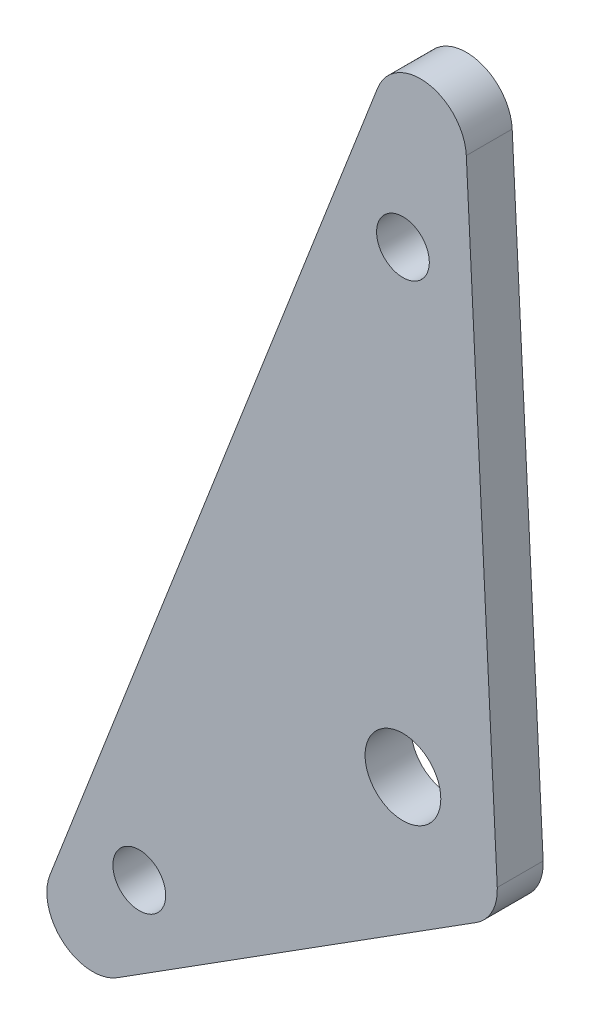
ISO-10303-21;
HEADER;
FILE_DESCRIPTION(('STEP AP214'),'2;1');
FILE_NAME('part.step','',(''),(''),'','','');
FILE_SCHEMA(('AUTOMOTIVE_DESIGN { 1 0 10303 214 1 1 1 1 }'));
ENDSEC;
DATA;
#1=APPLICATION_CONTEXT('core data for automotive mechanical design processes');
#2=APPLICATION_PROTOCOL_DEFINITION('international standard','automotive_design',2000,#1);
#3=PRODUCT_CONTEXT('',#1,'mechanical');
#4=PRODUCT('Part','Part','',(#3));
#5=PRODUCT_RELATED_PRODUCT_CATEGORY('part','',(#4));
#6=PRODUCT_DEFINITION_FORMATION('','',#4);
#7=PRODUCT_DEFINITION_CONTEXT('part definition',#1,'design');
#8=PRODUCT_DEFINITION('design','',#6,#7);
#9=PRODUCT_DEFINITION_SHAPE('','',#8);
#10=(LENGTH_UNIT() NAMED_UNIT(*) SI_UNIT(.MILLI.,.METRE.));
#11=(NAMED_UNIT(*) PLANE_ANGLE_UNIT() SI_UNIT($,.RADIAN.));
#12=(NAMED_UNIT(*) SI_UNIT($,.STERADIAN.) SOLID_ANGLE_UNIT());
#13=UNCERTAINTY_MEASURE_WITH_UNIT(LENGTH_MEASURE(1.E-05),#10,'distance_accuracy_value','');
#14=(GEOMETRIC_REPRESENTATION_CONTEXT(3) GLOBAL_UNCERTAINTY_ASSIGNED_CONTEXT((#13)) GLOBAL_UNIT_ASSIGNED_CONTEXT((#10,
#11,#12)) REPRESENTATION_CONTEXT('',''));
#15=CARTESIAN_POINT('',(0.,0.,0.));
#16=DIRECTION('',(0.,0.,1.));
#17=DIRECTION('',(1.,0.,0.));
#18=AXIS2_PLACEMENT_3D('',#15,#16,#17);
#19=CARTESIAN_POINT('',(0.764069965560594,24.737714391467,2.));
#20=DIRECTION('',(0.,0.,-1.));
#21=DIRECTION('',(-1.,0.,0.));
#22=AXIS2_PLACEMENT_3D('',#19,#20,#21);
#23=CYLINDRICAL_SURFACE('',#22,2.);
#24=CARTESIAN_POINT('',(0.764069965560594,24.737714391467,2.));
#25=DIRECTION('',(0.,0.,1.));
#26=DIRECTION('',(1.,0.,0.));
#27=AXIS2_PLACEMENT_3D('',#24,#25,#26);
#28=CIRCLE('',#27,2.);
#29=CARTESIAN_POINT('',(2.76156840110442,24.8377143914669,2.));
#30=VERTEX_POINT('',#29);
#31=CARTESIAN_POINT('',(-1.10071834008403,25.4606006723792,2.));
#32=VERTEX_POINT('',#31);
#33=EDGE_CURVE('E174',#30,#32,#28,.T.);
#34=ORIENTED_EDGE('',*,*,#33,.F.);
#35=DIRECTION('',(0.,0.,1.));
#36=VECTOR('',#35,1.);
#37=CARTESIAN_POINT('',(2.76156840110442,24.8377143914669,2.));
#38=LINE('',#37,#36);
#39=CARTESIAN_POINT('',(2.76156840110442,24.8377143914669,0.));
#40=VERTEX_POINT('',#39);
#41=EDGE_CURVE('E122',#40,#30,#38,.T.);
#42=ORIENTED_EDGE('',*,*,#41,.F.);
#43=CARTESIAN_POINT('',(0.764069965560594,24.737714391467,0.));
#44=DIRECTION('',(0.,0.,-1.));
#45=DIRECTION('',(1.,0.,0.));
#46=AXIS2_PLACEMENT_3D('',#43,#44,#45);
#47=CIRCLE('',#46,2.);
#48=CARTESIAN_POINT('',(-1.10071834008403,25.4606006723792,0.));
#49=VERTEX_POINT('',#48);
#50=EDGE_CURVE('E27',#49,#40,#47,.T.);
#51=ORIENTED_EDGE('',*,*,#50,.F.);
#52=DIRECTION('',(0.,0.,-1.));
#53=VECTOR('',#52,1.);
#54=CARTESIAN_POINT('',(-1.10071834008403,25.4606006723792,2.));
#55=LINE('',#54,#53);
#56=EDGE_CURVE('E140',#32,#49,#55,.T.);
#57=ORIENTED_EDGE('',*,*,#56,.F.);
#58=EDGE_LOOP('',(#34,#42,#51,#57));
#59=FACE_BOUND('',#58,.T.);
#60=ADVANCED_FACE('F17',(#59),#23,.T.);
#61=CARTESIAN_POINT('',(2.11328151066973,-2.21276511426466,2.));
#62=DIRECTION('',(0.,0.,-1.));
#63=DIRECTION('',(-1.,0.,0.));
#64=AXIS2_PLACEMENT_3D('',#61,#62,#63);
#65=CYLINDRICAL_SURFACE('',#64,2.);
#66=CARTESIAN_POINT('',(2.11328151066973,-2.21276511426466,2.));
#67=DIRECTION('',(0.,0.,1.));
#68=DIRECTION('',(1.,0.,0.));
#69=AXIS2_PLACEMENT_3D('',#66,#67,#68);
#70=CIRCLE('',#69,2.);
#71=CARTESIAN_POINT('',(3.18309963190795,-3.90258439083547,2.));
#72=VERTEX_POINT('',#71);
#73=CARTESIAN_POINT('',(4.11077994621355,-2.11276511426466,2.));
#74=VERTEX_POINT('',#73);
#75=EDGE_CURVE('E50',#72,#74,#70,.T.);
#76=ORIENTED_EDGE('',*,*,#75,.F.);
#77=DIRECTION('',(0.,0.,1.));
#78=VECTOR('',#77,1.);
#79=CARTESIAN_POINT('',(3.18309963190795,-3.90258439083547,2.));
#80=LINE('',#79,#78);
#81=CARTESIAN_POINT('',(3.18309963190795,-3.90258439083547,0.));
#82=VERTEX_POINT('',#81);
#83=EDGE_CURVE('E96',#82,#72,#80,.T.);
#84=ORIENTED_EDGE('',*,*,#83,.F.);
#85=CARTESIAN_POINT('',(2.11328151066973,-2.21276511426466,0.));
#86=DIRECTION('',(0.,0.,-1.));
#87=DIRECTION('',(1.,0.,0.));
#88=AXIS2_PLACEMENT_3D('',#85,#86,#87);
#89=CIRCLE('',#88,2.);
#90=CARTESIAN_POINT('',(4.11077994621355,-2.11276511426466,0.));
#91=VERTEX_POINT('',#90);
#92=EDGE_CURVE('E11',#91,#82,#89,.T.);
#93=ORIENTED_EDGE('',*,*,#92,.F.);
#94=DIRECTION('',(0.,0.,-1.));
#95=VECTOR('',#94,1.);
#96=CARTESIAN_POINT('',(4.11077994621355,-2.11276511426466,2.));
#97=LINE('',#96,#95);
#98=EDGE_CURVE('E154',#74,#91,#97,.T.);
#99=ORIENTED_EDGE('',*,*,#98,.F.);
#100=EDGE_LOOP('',(#76,#84,#93,#99));
#101=FACE_BOUND('',#100,.T.);
#102=ADVANCED_FACE('F19',(#101),#65,.T.);
#103=CARTESIAN_POINT('',(0.,0.,0.));
#104=DIRECTION('',(0.,0.,1.));
#105=DIRECTION('',(1.,0.,0.));
#106=AXIS2_PLACEMENT_3D('',#103,#104,#105);
#107=PLANE('',#106);
#108=CARTESIAN_POINT('',(-11.4906666467847,-9.64181414529806,0.));
#109=DIRECTION('',(0.,0.,1.));
#110=DIRECTION('',(1.,0.,0.));
#111=AXIS2_PLACEMENT_3D('',#108,#109,#110);
#112=CIRCLE('',#111,1.15);
#113=CARTESIAN_POINT('',(-10.3406666467847,-9.64181414529806,0.));
#114=VERTEX_POINT('',#113);
#115=EDGE_CURVE('E126',#114,#114,#112,.T.);
#116=ORIENTED_EDGE('',*,*,#115,.T.);
#117=EDGE_LOOP('',(#116));
#118=FACE_BOUND('',#117,.T.);
#119=CARTESIAN_POINT('',(0.,20.,0.));
#120=DIRECTION('',(0.,0.,1.));
#121=DIRECTION('',(1.,0.,0.));
#122=AXIS2_PLACEMENT_3D('',#119,#120,#121);
#123=CIRCLE('',#122,1.15);
#124=CARTESIAN_POINT('',(1.15,20.,0.));
#125=VERTEX_POINT('',#124);
#126=EDGE_CURVE('E142',#125,#125,#123,.T.);
#127=ORIENTED_EDGE('',*,*,#126,.T.);
#128=EDGE_LOOP('',(#127));
#129=FACE_BOUND('',#128,.T.);
#130=CARTESIAN_POINT('',(0.,0.,0.));
#131=DIRECTION('',(0.,0.,1.));
#132=DIRECTION('',(1.,0.,0.));
#133=AXIS2_PLACEMENT_3D('',#130,#131,#132);
#134=CIRCLE('',#133,1.65);
#135=CARTESIAN_POINT('',(1.65,0.,0.));
#136=VERTEX_POINT('',#135);
#137=EDGE_CURVE('E130',#136,#136,#134,.T.);
#138=ORIENTED_EDGE('',*,*,#137,.T.);
#139=EDGE_LOOP('',(#138));
#140=FACE_BOUND('',#139,.T.);
#141=DIRECTION('',(-0.844909638285409,-0.53490906061911,0.));
#142=VECTOR('',#141,1.);
#143=CARTESIAN_POINT('',(2.67454530309555,-4.22454819142705,0.));
#144=LINE('',#143,#142);
#145=CARTESIAN_POINT('',(-12.4502094461774,-13.799972578165,0.));
#146=VERTEX_POINT('',#145);
#147=EDGE_CURVE('E87',#82,#146,#144,.T.);
#148=ORIENTED_EDGE('',*,*,#147,.T.);
#149=CARTESIAN_POINT('',(-13.5200275674156,-12.1101533015942,0.));
#150=DIRECTION('',(0.,0.,-1.));
#151=DIRECTION('',(1.,0.,0.));
#152=AXIS2_PLACEMENT_3D('',#149,#150,#151);
#153=CIRCLE('',#152,2.);
#154=CARTESIAN_POINT('',(-15.3848158730602,-11.387267020682,0.));
#155=VERTEX_POINT('',#154);
#156=EDGE_CURVE('E95',#146,#155,#153,.T.);
#157=ORIENTED_EDGE('',*,*,#156,.T.);
#158=DIRECTION('',(0.361443140456094,0.932394152822312,0.));
#159=VECTOR('',#158,1.);
#160=CARTESIAN_POINT('',(-9.53733187324684,3.69715229702356,0.));
#161=LINE('',#160,#159);
#162=EDGE_CURVE('E163',#155,#49,#161,.T.);
#163=ORIENTED_EDGE('',*,*,#162,.T.);
#164=ORIENTED_EDGE('',*,*,#50,.T.);
#165=DIRECTION('',(0.05,-0.998749217771909,0.));
#166=VECTOR('',#165,1.);
#167=CARTESIAN_POINT('',(3.99499687108763,0.2,0.));
#168=LINE('',#167,#166);
#169=EDGE_CURVE('E157',#40,#91,#168,.T.);
#170=ORIENTED_EDGE('',*,*,#169,.T.);
#171=ORIENTED_EDGE('',*,*,#92,.T.);
#172=EDGE_LOOP('',(#148,#157,#163,#164,#170,#171));
#173=FACE_BOUND('',#172,.T.);
#174=ADVANCED_FACE('F90',(#118,#129,#140,#173),#107,.F.);
#175=CARTESIAN_POINT('',(0.,0.,2.));
#176=DIRECTION('',(0.,0.,1.));
#177=DIRECTION('',(1.,0.,0.));
#178=AXIS2_PLACEMENT_3D('',#175,#176,#177);
#179=PLANE('',#178);
#180=CARTESIAN_POINT('',(-11.4906666467847,-9.64181414529806,2.));
#181=DIRECTION('',(0.,0.,1.));
#182=DIRECTION('',(1.,0.,0.));
#183=AXIS2_PLACEMENT_3D('',#180,#181,#182);
#184=CIRCLE('',#183,1.15);
#185=CARTESIAN_POINT('',(-10.3406666467847,-9.64181414529806,2.));
#186=VERTEX_POINT('',#185);
#187=EDGE_CURVE('E135',#186,#186,#184,.T.);
#188=ORIENTED_EDGE('',*,*,#187,.F.);
#189=EDGE_LOOP('',(#188));
#190=FACE_BOUND('',#189,.T.);
#191=CARTESIAN_POINT('',(0.,20.,2.));
#192=DIRECTION('',(0.,0.,1.));
#193=DIRECTION('',(1.,0.,0.));
#194=AXIS2_PLACEMENT_3D('',#191,#192,#193);
#195=CIRCLE('',#194,1.15);
#196=CARTESIAN_POINT('',(1.15,20.,2.));
#197=VERTEX_POINT('',#196);
#198=EDGE_CURVE('E137',#197,#197,#195,.T.);
#199=ORIENTED_EDGE('',*,*,#198,.F.);
#200=EDGE_LOOP('',(#199));
#201=FACE_BOUND('',#200,.T.);
#202=CARTESIAN_POINT('',(0.,0.,2.));
#203=DIRECTION('',(0.,0.,1.));
#204=DIRECTION('',(1.,0.,0.));
#205=AXIS2_PLACEMENT_3D('',#202,#203,#204);
#206=CIRCLE('',#205,1.65);
#207=CARTESIAN_POINT('',(1.65,0.,2.));
#208=VERTEX_POINT('',#207);
#209=EDGE_CURVE('E106',#208,#208,#206,.T.);
#210=ORIENTED_EDGE('',*,*,#209,.F.);
#211=EDGE_LOOP('',(#210));
#212=FACE_BOUND('',#211,.T.);
#213=DIRECTION('',(0.361443140456094,0.932394152822312,0.));
#214=VECTOR('',#213,1.);
#215=CARTESIAN_POINT('',(-9.53733187324684,3.69715229702356,2.));
#216=LINE('',#215,#214);
#217=CARTESIAN_POINT('',(-15.3848158730602,-11.387267020682,2.));
#218=VERTEX_POINT('',#217);
#219=EDGE_CURVE('E143',#218,#32,#216,.T.);
#220=ORIENTED_EDGE('',*,*,#219,.F.);
#221=CARTESIAN_POINT('',(-13.5200275674156,-12.1101533015942,2.));
#222=DIRECTION('',(0.,0.,1.));
#223=DIRECTION('',(1.,0.,0.));
#224=AXIS2_PLACEMENT_3D('',#221,#222,#223);
#225=CIRCLE('',#224,2.);
#226=CARTESIAN_POINT('',(-12.4502094461774,-13.799972578165,2.));
#227=VERTEX_POINT('',#226);
#228=EDGE_CURVE('E114',#218,#227,#225,.T.);
#229=ORIENTED_EDGE('',*,*,#228,.T.);
#230=DIRECTION('',(-0.844909638285409,-0.53490906061911,0.));
#231=VECTOR('',#230,1.);
#232=CARTESIAN_POINT('',(2.67454530309555,-4.22454819142705,2.));
#233=LINE('',#232,#231);
#234=EDGE_CURVE('E100',#72,#227,#233,.T.);
#235=ORIENTED_EDGE('',*,*,#234,.F.);
#236=ORIENTED_EDGE('',*,*,#75,.T.);
#237=DIRECTION('',(0.05,-0.998749217771909,0.));
#238=VECTOR('',#237,1.);
#239=CARTESIAN_POINT('',(3.99499687108763,0.2,2.));
#240=LINE('',#239,#238);
#241=EDGE_CURVE('E131',#30,#74,#240,.T.);
#242=ORIENTED_EDGE('',*,*,#241,.F.);
#243=ORIENTED_EDGE('',*,*,#33,.T.);
#244=EDGE_LOOP('',(#220,#229,#235,#236,#242,#243));
#245=FACE_BOUND('',#244,.T.);
#246=ADVANCED_FACE('F189',(#190,#201,#212,#245),#179,.T.);
#247=CARTESIAN_POINT('',(2.67454530309555,-4.22454819142705,2.));
#248=DIRECTION('',(0.53490906061911,-0.844909638285409,0.));
#249=DIRECTION('',(0.,0.,-1.));
#250=AXIS2_PLACEMENT_3D('',#247,#248,#249);
#251=PLANE('',#250);
#252=ORIENTED_EDGE('',*,*,#234,.T.);
#253=DIRECTION('',(0.,0.,-1.));
#254=VECTOR('',#253,1.);
#255=CARTESIAN_POINT('',(-12.4502094461774,-13.799972578165,2.));
#256=LINE('',#255,#254);
#257=EDGE_CURVE('E99',#227,#146,#256,.T.);
#258=ORIENTED_EDGE('',*,*,#257,.T.);
#259=ORIENTED_EDGE('',*,*,#147,.F.);
#260=ORIENTED_EDGE('',*,*,#83,.T.);
#261=EDGE_LOOP('',(#252,#258,#259,#260));
#262=FACE_BOUND('',#261,.T.);
#263=ADVANCED_FACE('F101',(#262),#251,.T.);
#264=CARTESIAN_POINT('',(-9.53733187324684,3.69715229702356,2.));
#265=DIRECTION('',(-0.932394152822312,0.361443140456094,0.));
#266=DIRECTION('',(0.,0.,1.));
#267=AXIS2_PLACEMENT_3D('',#264,#265,#266);
#268=PLANE('',#267);
#269=ORIENTED_EDGE('',*,*,#162,.F.);
#270=DIRECTION('',(0.,0.,1.));
#271=VECTOR('',#270,1.);
#272=CARTESIAN_POINT('',(-15.3848158730602,-11.387267020682,2.));
#273=LINE('',#272,#271);
#274=EDGE_CURVE('E109',#155,#218,#273,.T.);
#275=ORIENTED_EDGE('',*,*,#274,.T.);
#276=ORIENTED_EDGE('',*,*,#219,.T.);
#277=ORIENTED_EDGE('',*,*,#56,.T.);
#278=EDGE_LOOP('',(#269,#275,#276,#277));
#279=FACE_BOUND('',#278,.T.);
#280=ADVANCED_FACE('F191',(#279),#268,.T.);
#281=CARTESIAN_POINT('',(3.99499687108763,0.2,2.));
#282=DIRECTION('',(0.998749217771909,0.05,0.));
#283=DIRECTION('',(0.,0.,-1.));
#284=AXIS2_PLACEMENT_3D('',#281,#282,#283);
#285=PLANE('',#284);
#286=ORIENTED_EDGE('',*,*,#241,.T.);
#287=ORIENTED_EDGE('',*,*,#98,.T.);
#288=ORIENTED_EDGE('',*,*,#169,.F.);
#289=ORIENTED_EDGE('',*,*,#41,.T.);
#290=EDGE_LOOP('',(#286,#287,#288,#289));
#291=FACE_BOUND('',#290,.T.);
#292=ADVANCED_FACE('F190',(#291),#285,.T.);
#293=CARTESIAN_POINT('',(-11.4906666467847,-9.64181414529806,2.));
#294=DIRECTION('',(0.,0.,-1.));
#295=DIRECTION('',(-1.,0.,0.));
#296=AXIS2_PLACEMENT_3D('',#293,#294,#295);
#297=CYLINDRICAL_SURFACE('',#296,1.15);
#298=ORIENTED_EDGE('',*,*,#115,.F.);
#299=EDGE_LOOP('',(#298));
#300=FACE_BOUND('',#299,.T.);
#301=ORIENTED_EDGE('',*,*,#187,.T.);
#302=EDGE_LOOP('',(#301));
#303=FACE_BOUND('',#302,.T.);
#304=ADVANCED_FACE('F205',(#300,#303),#297,.F.);
#305=CARTESIAN_POINT('',(0.,20.,2.));
#306=DIRECTION('',(0.,0.,-1.));
#307=DIRECTION('',(-1.,0.,0.));
#308=AXIS2_PLACEMENT_3D('',#305,#306,#307);
#309=CYLINDRICAL_SURFACE('',#308,1.15);
#310=ORIENTED_EDGE('',*,*,#126,.F.);
#311=EDGE_LOOP('',(#310));
#312=FACE_BOUND('',#311,.T.);
#313=ORIENTED_EDGE('',*,*,#198,.T.);
#314=EDGE_LOOP('',(#313));
#315=FACE_BOUND('',#314,.T.);
#316=ADVANCED_FACE('F214',(#312,#315),#309,.F.);
#317=CARTESIAN_POINT('',(0.,0.,2.));
#318=DIRECTION('',(0.,0.,-1.));
#319=DIRECTION('',(-1.,0.,0.));
#320=AXIS2_PLACEMENT_3D('',#317,#318,#319);
#321=CYLINDRICAL_SURFACE('',#320,1.65);
#322=ORIENTED_EDGE('',*,*,#137,.F.);
#323=EDGE_LOOP('',(#322));
#324=FACE_BOUND('',#323,.T.);
#325=ORIENTED_EDGE('',*,*,#209,.T.);
#326=EDGE_LOOP('',(#325));
#327=FACE_BOUND('',#326,.T.);
#328=ADVANCED_FACE('F215',(#324,#327),#321,.F.);
#329=CARTESIAN_POINT('',(-13.5200275674156,-12.1101533015942,2.));
#330=DIRECTION('',(0.,0.,-1.));
#331=DIRECTION('',(-1.,0.,0.));
#332=AXIS2_PLACEMENT_3D('',#329,#330,#331);
#333=CYLINDRICAL_SURFACE('',#332,2.);
#334=ORIENTED_EDGE('',*,*,#228,.F.);
#335=ORIENTED_EDGE('',*,*,#274,.F.);
#336=ORIENTED_EDGE('',*,*,#156,.F.);
#337=ORIENTED_EDGE('',*,*,#257,.F.);
#338=EDGE_LOOP('',(#334,#335,#336,#337));
#339=FACE_BOUND('',#338,.T.);
#340=ADVANCED_FACE('F107',(#339),#333,.T.);
#341=CLOSED_SHELL('',(#60,#102,#174,#246,#263,#280,#292,#304,#316,#328,#340));
#342=MANIFOLD_SOLID_BREP('B1',#341);
#343=ADVANCED_BREP_SHAPE_REPRESENTATION('',(#18,#342),#14);
#344=SHAPE_DEFINITION_REPRESENTATION(#9,#343);
ENDSEC;
END-ISO-10303-21;
